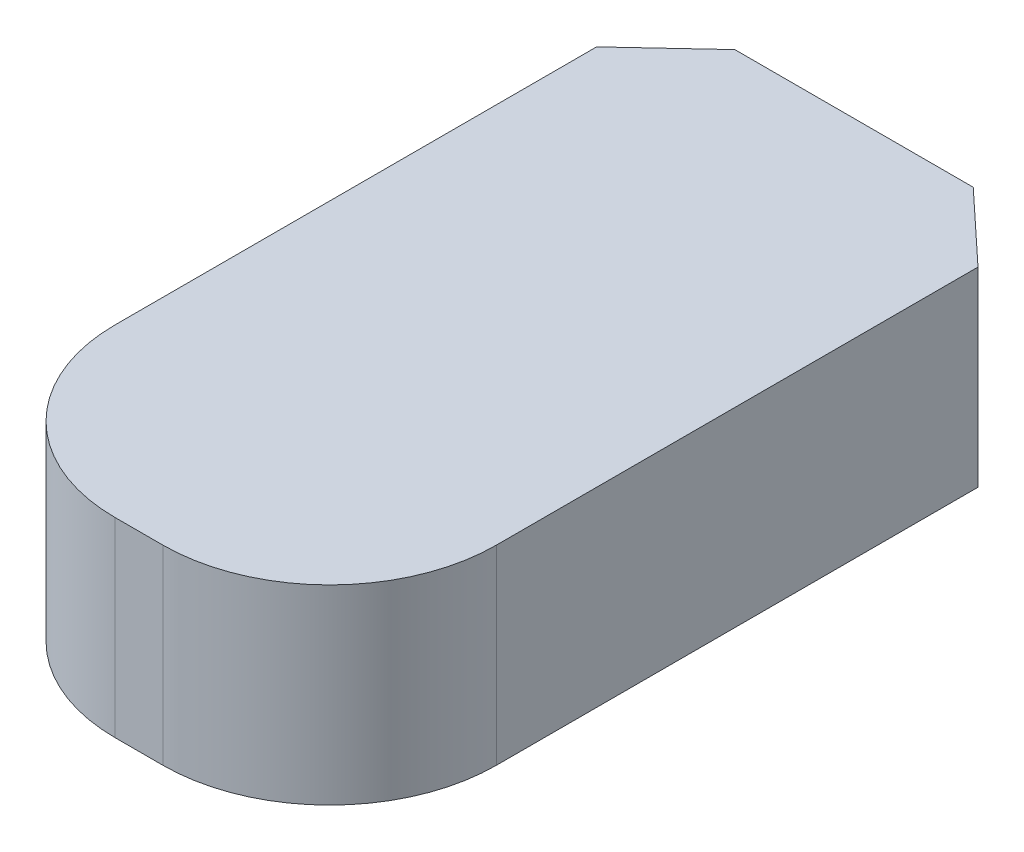
ISO-10303-21;
HEADER;
FILE_DESCRIPTION(('STEP AP214'),'2;1');
FILE_NAME('part.step','',(''),(''),'','','');
FILE_SCHEMA(('AUTOMOTIVE_DESIGN { 1 0 10303 214 1 1 1 1 }'));
ENDSEC;
DATA;
#1=APPLICATION_CONTEXT('core data for automotive mechanical design processes');
#2=APPLICATION_PROTOCOL_DEFINITION('international standard','automotive_design',2000,#1);
#3=PRODUCT_CONTEXT('',#1,'mechanical');
#4=PRODUCT('Part','Part','',(#3));
#5=PRODUCT_RELATED_PRODUCT_CATEGORY('part','',(#4));
#6=PRODUCT_DEFINITION_FORMATION('','',#4);
#7=PRODUCT_DEFINITION_CONTEXT('part definition',#1,'design');
#8=PRODUCT_DEFINITION('design','',#6,#7);
#9=PRODUCT_DEFINITION_SHAPE('','',#8);
#10=(LENGTH_UNIT() NAMED_UNIT(*) SI_UNIT(.MILLI.,.METRE.));
#11=(NAMED_UNIT(*) PLANE_ANGLE_UNIT() SI_UNIT($,.RADIAN.));
#12=(NAMED_UNIT(*) SI_UNIT($,.STERADIAN.) SOLID_ANGLE_UNIT());
#13=UNCERTAINTY_MEASURE_WITH_UNIT(LENGTH_MEASURE(1.E-05),#10,'distance_accuracy_value','');
#14=(GEOMETRIC_REPRESENTATION_CONTEXT(3) GLOBAL_UNCERTAINTY_ASSIGNED_CONTEXT((#13)) GLOBAL_UNIT_ASSIGNED_CONTEXT((#10,
#11,#12)) REPRESENTATION_CONTEXT('',''));
#15=CARTESIAN_POINT('',(0.,0.,0.));
#16=DIRECTION('',(0.,0.,1.));
#17=DIRECTION('',(1.,0.,0.));
#18=AXIS2_PLACEMENT_3D('',#15,#16,#17);
#19=CARTESIAN_POINT('',(2.50000000000001,20.,20.));
#20=DIRECTION('',(0.,-1.,0.));
#21=DIRECTION('',(0.,0.,-1.));
#22=AXIS2_PLACEMENT_3D('',#19,#20,#21);
#23=CYLINDRICAL_SURFACE('',#22,17.5);
#24=CARTESIAN_POINT('',(2.50000000000001,0.,20.));
#25=DIRECTION('',(0.,1.,0.));
#26=DIRECTION('',(0.,0.,1.));
#27=AXIS2_PLACEMENT_3D('',#24,#25,#26);
#28=CIRCLE('',#27,17.5);
#29=CARTESIAN_POINT('',(2.49999999999988,0.,37.5));
#30=VERTEX_POINT('',#29);
#31=CARTESIAN_POINT('',(20.,0.,19.9999999999999));
#32=VERTEX_POINT('',#31);
#33=EDGE_CURVE('E138',#30,#32,#28,.T.);
#34=ORIENTED_EDGE('',*,*,#33,.T.);
#35=DIRECTION('',(0.,-1.,0.));
#36=VECTOR('',#35,1.);
#37=CARTESIAN_POINT('',(20.,20.,19.9999999999999));
#38=LINE('',#37,#36);
#39=CARTESIAN_POINT('',(20.,20.,19.9999999999999));
#40=VERTEX_POINT('',#39);
#41=EDGE_CURVE('E11',#40,#32,#38,.T.);
#42=ORIENTED_EDGE('',*,*,#41,.F.);
#43=CARTESIAN_POINT('',(2.50000000000001,20.,20.));
#44=DIRECTION('',(0.,1.,0.));
#45=DIRECTION('',(0.,0.,1.));
#46=AXIS2_PLACEMENT_3D('',#43,#44,#45);
#47=CIRCLE('',#46,17.5);
#48=CARTESIAN_POINT('',(2.49999999999988,20.,37.5));
#49=VERTEX_POINT('',#48);
#50=EDGE_CURVE('E152',#49,#40,#47,.T.);
#51=ORIENTED_EDGE('',*,*,#50,.F.);
#52=DIRECTION('',(0.,-1.,0.));
#53=VECTOR('',#52,1.);
#54=CARTESIAN_POINT('',(2.49999999999988,20.,37.5));
#55=LINE('',#54,#53);
#56=EDGE_CURVE('E134',#49,#30,#55,.T.);
#57=ORIENTED_EDGE('',*,*,#56,.T.);
#58=EDGE_LOOP('',(#34,#42,#51,#57));
#59=FACE_BOUND('',#58,.T.);
#60=ADVANCED_FACE('F42',(#59),#23,.T.);
#61=CARTESIAN_POINT('',(20.,20.,-30.5));
#62=DIRECTION('',(-1.,0.,0.));
#63=DIRECTION('',(0.,0.,1.));
#64=AXIS2_PLACEMENT_3D('',#61,#62,#63);
#65=PLANE('',#64);
#66=DIRECTION('',(0.,0.,-1.));
#67=VECTOR('',#66,1.);
#68=CARTESIAN_POINT('',(20.,0.,-30.5));
#69=LINE('',#68,#67);
#70=CARTESIAN_POINT('',(20.,0.,-30.5));
#71=VERTEX_POINT('',#70);
#72=EDGE_CURVE('E141',#32,#71,#69,.T.);
#73=ORIENTED_EDGE('',*,*,#72,.T.);
#74=DIRECTION('',(0.,-1.,0.));
#75=VECTOR('',#74,1.);
#76=CARTESIAN_POINT('',(20.,20.,-30.5));
#77=LINE('',#76,#75);
#78=CARTESIAN_POINT('',(20.,20.,-30.5));
#79=VERTEX_POINT('',#78);
#80=EDGE_CURVE('E50',#79,#71,#77,.T.);
#81=ORIENTED_EDGE('',*,*,#80,.F.);
#82=DIRECTION('',(0.,0.,-1.));
#83=VECTOR('',#82,1.);
#84=CARTESIAN_POINT('',(20.,20.,-30.5));
#85=LINE('',#84,#83);
#86=EDGE_CURVE('E101',#40,#79,#85,.T.);
#87=ORIENTED_EDGE('',*,*,#86,.F.);
#88=ORIENTED_EDGE('',*,*,#41,.T.);
#89=EDGE_LOOP('',(#73,#81,#87,#88));
#90=FACE_BOUND('',#89,.T.);
#91=ADVANCED_FACE('F187',(#90),#65,.F.);
#92=CARTESIAN_POINT('',(12.5,20.,-37.5));
#93=DIRECTION('',(-0.682318250360011,0.,0.731055268242869));
#94=DIRECTION('',(0.731055268242869,0.,0.682318250360011));
#95=AXIS2_PLACEMENT_3D('',#92,#93,#94);
#96=PLANE('',#95);
#97=DIRECTION('',(-0.731055268242869,0.,-0.682318250360011));
#98=VECTOR('',#97,1.);
#99=CARTESIAN_POINT('',(12.5,0.,-37.5));
#100=LINE('',#99,#98);
#101=CARTESIAN_POINT('',(12.5,0.,-37.5));
#102=VERTEX_POINT('',#101);
#103=EDGE_CURVE('E143',#71,#102,#100,.T.);
#104=ORIENTED_EDGE('',*,*,#103,.T.);
#105=DIRECTION('',(0.,-1.,0.));
#106=VECTOR('',#105,1.);
#107=CARTESIAN_POINT('',(12.5,20.,-37.5));
#108=LINE('',#107,#106);
#109=CARTESIAN_POINT('',(12.5,20.,-37.5));
#110=VERTEX_POINT('',#109);
#111=EDGE_CURVE('E159',#110,#102,#108,.T.);
#112=ORIENTED_EDGE('',*,*,#111,.F.);
#113=DIRECTION('',(-0.731055268242869,0.,-0.682318250360011));
#114=VECTOR('',#113,1.);
#115=CARTESIAN_POINT('',(12.5,20.,-37.5));
#116=LINE('',#115,#114);
#117=EDGE_CURVE('E167',#79,#110,#116,.T.);
#118=ORIENTED_EDGE('',*,*,#117,.F.);
#119=ORIENTED_EDGE('',*,*,#80,.T.);
#120=EDGE_LOOP('',(#104,#112,#118,#119));
#121=FACE_BOUND('',#120,.T.);
#122=ADVANCED_FACE('F165',(#121),#96,.F.);
#123=CARTESIAN_POINT('',(-12.5,20.,-37.5));
#124=DIRECTION('',(0.,0.,1.));
#125=DIRECTION('',(1.,0.,0.));
#126=AXIS2_PLACEMENT_3D('',#123,#124,#125);
#127=PLANE('',#126);
#128=DIRECTION('',(-1.,0.,0.));
#129=VECTOR('',#128,1.);
#130=CARTESIAN_POINT('',(-12.5,0.,-37.5));
#131=LINE('',#130,#129);
#132=CARTESIAN_POINT('',(-12.5,0.,-37.5));
#133=VERTEX_POINT('',#132);
#134=EDGE_CURVE('E145',#102,#133,#131,.T.);
#135=ORIENTED_EDGE('',*,*,#134,.T.);
#136=DIRECTION('',(0.,-1.,0.));
#137=VECTOR('',#136,1.);
#138=CARTESIAN_POINT('',(-12.5,20.,-37.5));
#139=LINE('',#138,#137);
#140=CARTESIAN_POINT('',(-12.5,20.,-37.5));
#141=VERTEX_POINT('',#140);
#142=EDGE_CURVE('E156',#141,#133,#139,.T.);
#143=ORIENTED_EDGE('',*,*,#142,.F.);
#144=DIRECTION('',(-1.,0.,0.));
#145=VECTOR('',#144,1.);
#146=CARTESIAN_POINT('',(-12.5,20.,-37.5));
#147=LINE('',#146,#145);
#148=EDGE_CURVE('E179',#110,#141,#147,.T.);
#149=ORIENTED_EDGE('',*,*,#148,.F.);
#150=ORIENTED_EDGE('',*,*,#111,.T.);
#151=EDGE_LOOP('',(#135,#143,#149,#150));
#152=FACE_BOUND('',#151,.T.);
#153=ADVANCED_FACE('F175',(#152),#127,.F.);
#154=CARTESIAN_POINT('',(-12.5,20.,-37.5));
#155=DIRECTION('',(0.682318250360011,0.,0.731055268242869));
#156=DIRECTION('',(0.731055268242869,0.,-0.682318250360011));
#157=AXIS2_PLACEMENT_3D('',#154,#155,#156);
#158=PLANE('',#157);
#159=DIRECTION('',(-0.731055268242869,0.,0.682318250360011));
#160=VECTOR('',#159,1.);
#161=CARTESIAN_POINT('',(-12.5,0.,-37.5));
#162=LINE('',#161,#160);
#163=CARTESIAN_POINT('',(-20.,0.,-30.5));
#164=VERTEX_POINT('',#163);
#165=EDGE_CURVE('E147',#133,#164,#162,.T.);
#166=ORIENTED_EDGE('',*,*,#165,.T.);
#167=DIRECTION('',(0.,-1.,0.));
#168=VECTOR('',#167,1.);
#169=CARTESIAN_POINT('',(-20.,20.,-30.5));
#170=LINE('',#169,#168);
#171=CARTESIAN_POINT('',(-20.,20.,-30.5));
#172=VERTEX_POINT('',#171);
#173=EDGE_CURVE('E129',#172,#164,#170,.T.);
#174=ORIENTED_EDGE('',*,*,#173,.F.);
#175=DIRECTION('',(-0.731055268242869,0.,0.682318250360011));
#176=VECTOR('',#175,1.);
#177=CARTESIAN_POINT('',(-12.5,20.,-37.5));
#178=LINE('',#177,#176);
#179=EDGE_CURVE('E120',#141,#172,#178,.T.);
#180=ORIENTED_EDGE('',*,*,#179,.F.);
#181=ORIENTED_EDGE('',*,*,#142,.T.);
#182=EDGE_LOOP('',(#166,#174,#180,#181));
#183=FACE_BOUND('',#182,.T.);
#184=ADVANCED_FACE('F178',(#183),#158,.F.);
#185=CARTESIAN_POINT('',(-20.,20.,-30.5));
#186=DIRECTION('',(1.,0.,0.));
#187=DIRECTION('',(0.,0.,-1.));
#188=AXIS2_PLACEMENT_3D('',#185,#186,#187);
#189=PLANE('',#188);
#190=DIRECTION('',(0.,0.,1.));
#191=VECTOR('',#190,1.);
#192=CARTESIAN_POINT('',(-20.,0.,-30.5));
#193=LINE('',#192,#191);
#194=CARTESIAN_POINT('',(-20.,0.,19.9999999999999));
#195=VERTEX_POINT('',#194);
#196=EDGE_CURVE('E128',#164,#195,#193,.T.);
#197=ORIENTED_EDGE('',*,*,#196,.T.);
#198=DIRECTION('',(0.,-1.,0.));
#199=VECTOR('',#198,1.);
#200=CARTESIAN_POINT('',(-20.,20.,19.9999999999999));
#201=LINE('',#200,#199);
#202=CARTESIAN_POINT('',(-20.,20.,19.9999999999999));
#203=VERTEX_POINT('',#202);
#204=EDGE_CURVE('E125',#203,#195,#201,.T.);
#205=ORIENTED_EDGE('',*,*,#204,.F.);
#206=DIRECTION('',(0.,0.,1.));
#207=VECTOR('',#206,1.);
#208=CARTESIAN_POINT('',(-20.,20.,-30.5));
#209=LINE('',#208,#207);
#210=EDGE_CURVE('E114',#172,#203,#209,.T.);
#211=ORIENTED_EDGE('',*,*,#210,.F.);
#212=ORIENTED_EDGE('',*,*,#173,.T.);
#213=EDGE_LOOP('',(#197,#205,#211,#212));
#214=FACE_BOUND('',#213,.T.);
#215=ADVANCED_FACE('F126',(#214),#189,.F.);
#216=CARTESIAN_POINT('',(-2.5,20.,20.));
#217=DIRECTION('',(0.,-1.,0.));
#218=DIRECTION('',(0.,0.,-1.));
#219=AXIS2_PLACEMENT_3D('',#216,#217,#218);
#220=CYLINDRICAL_SURFACE('',#219,17.5);
#221=CARTESIAN_POINT('',(-2.5,0.,20.));
#222=DIRECTION('',(0.,1.,0.));
#223=DIRECTION('',(0.,0.,1.));
#224=AXIS2_PLACEMENT_3D('',#221,#222,#223);
#225=CIRCLE('',#224,17.5);
#226=CARTESIAN_POINT('',(-2.49999999999987,0.,37.5));
#227=VERTEX_POINT('',#226);
#228=EDGE_CURVE('E87',#195,#227,#225,.T.);
#229=ORIENTED_EDGE('',*,*,#228,.T.);
#230=DIRECTION('',(0.,-1.,0.));
#231=VECTOR('',#230,1.);
#232=CARTESIAN_POINT('',(-2.49999999999987,20.,37.5));
#233=LINE('',#232,#231);
#234=CARTESIAN_POINT('',(-2.49999999999987,20.,37.5));
#235=VERTEX_POINT('',#234);
#236=EDGE_CURVE('E130',#235,#227,#233,.T.);
#237=ORIENTED_EDGE('',*,*,#236,.F.);
#238=CARTESIAN_POINT('',(-2.5,20.,20.));
#239=DIRECTION('',(0.,1.,0.));
#240=DIRECTION('',(0.,0.,1.));
#241=AXIS2_PLACEMENT_3D('',#238,#239,#240);
#242=CIRCLE('',#241,17.5);
#243=EDGE_CURVE('E118',#203,#235,#242,.T.);
#244=ORIENTED_EDGE('',*,*,#243,.F.);
#245=ORIENTED_EDGE('',*,*,#204,.T.);
#246=EDGE_LOOP('',(#229,#237,#244,#245));
#247=FACE_BOUND('',#246,.T.);
#248=ADVANCED_FACE('F132',(#247),#220,.T.);
#249=CARTESIAN_POINT('',(-2.49999999999987,20.,37.5));
#250=DIRECTION('',(0.,0.,-1.));
#251=DIRECTION('',(-1.,0.,0.));
#252=AXIS2_PLACEMENT_3D('',#249,#250,#251);
#253=PLANE('',#252);
#254=DIRECTION('',(1.,0.,0.));
#255=VECTOR('',#254,1.);
#256=CARTESIAN_POINT('',(-2.49999999999987,0.,37.5));
#257=LINE('',#256,#255);
#258=EDGE_CURVE('E93',#227,#30,#257,.T.);
#259=ORIENTED_EDGE('',*,*,#258,.T.);
#260=ORIENTED_EDGE('',*,*,#56,.F.);
#261=DIRECTION('',(1.,0.,0.));
#262=VECTOR('',#261,1.);
#263=CARTESIAN_POINT('',(-2.49999999999987,20.,37.5));
#264=LINE('',#263,#262);
#265=EDGE_CURVE('E58',#235,#49,#264,.T.);
#266=ORIENTED_EDGE('',*,*,#265,.F.);
#267=ORIENTED_EDGE('',*,*,#236,.T.);
#268=EDGE_LOOP('',(#259,#260,#266,#267));
#269=FACE_BOUND('',#268,.T.);
#270=ADVANCED_FACE('F203',(#269),#253,.F.);
#271=CARTESIAN_POINT('',(2.50000000000001,20.,20.));
#272=DIRECTION('',(0.,1.,0.));
#273=DIRECTION('',(0.,0.,1.));
#274=AXIS2_PLACEMENT_3D('',#271,#272,#273);
#275=PLANE('',#274);
#276=ORIENTED_EDGE('',*,*,#50,.T.);
#277=ORIENTED_EDGE('',*,*,#86,.T.);
#278=ORIENTED_EDGE('',*,*,#117,.T.);
#279=ORIENTED_EDGE('',*,*,#148,.T.);
#280=ORIENTED_EDGE('',*,*,#179,.T.);
#281=ORIENTED_EDGE('',*,*,#210,.T.);
#282=ORIENTED_EDGE('',*,*,#243,.T.);
#283=ORIENTED_EDGE('',*,*,#265,.T.);
#284=EDGE_LOOP('',(#276,#277,#278,#279,#280,#281,#282,#283));
#285=FACE_BOUND('',#284,.T.);
#286=ADVANCED_FACE('F116',(#285),#275,.T.);
#287=CARTESIAN_POINT('',(2.50000000000001,0.,20.));
#288=DIRECTION('',(0.,1.,0.));
#289=DIRECTION('',(0.,0.,1.));
#290=AXIS2_PLACEMENT_3D('',#287,#288,#289);
#291=PLANE('',#290);
#292=ORIENTED_EDGE('',*,*,#33,.F.);
#293=ORIENTED_EDGE('',*,*,#258,.F.);
#294=ORIENTED_EDGE('',*,*,#228,.F.);
#295=ORIENTED_EDGE('',*,*,#196,.F.);
#296=ORIENTED_EDGE('',*,*,#165,.F.);
#297=ORIENTED_EDGE('',*,*,#134,.F.);
#298=ORIENTED_EDGE('',*,*,#103,.F.);
#299=ORIENTED_EDGE('',*,*,#72,.F.);
#300=EDGE_LOOP('',(#292,#293,#294,#295,#296,#297,#298,#299));
#301=FACE_BOUND('',#300,.T.);
#302=ADVANCED_FACE('F171',(#301),#291,.F.);
#303=CLOSED_SHELL('',(#60,#91,#122,#153,#184,#215,#248,#270,#286,#302));
#304=MANIFOLD_SOLID_BREP('B2',#303);
#305=ADVANCED_BREP_SHAPE_REPRESENTATION('',(#18,#304),#14);
#306=SHAPE_DEFINITION_REPRESENTATION(#9,#305);
ENDSEC;
END-ISO-10303-21;
